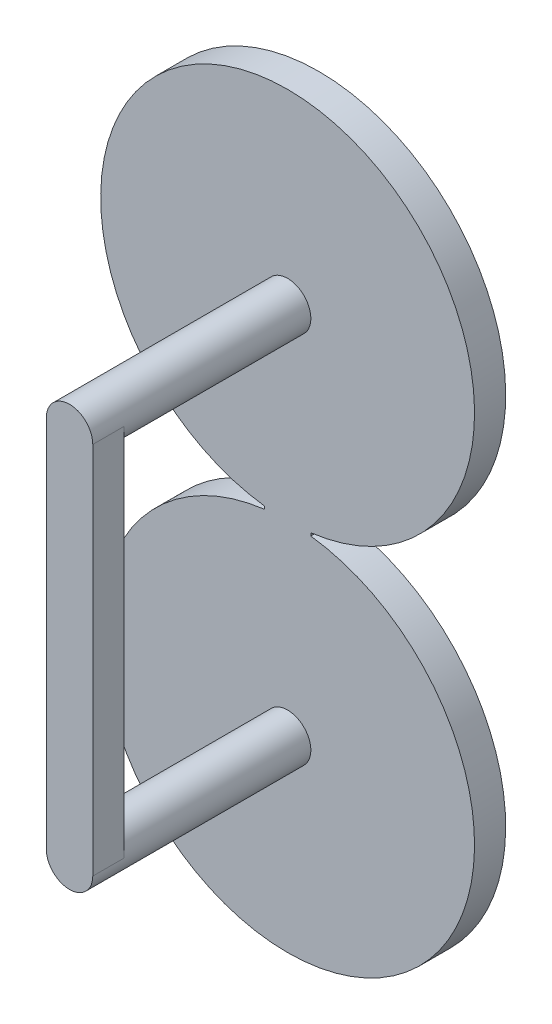
ISO-10303-21;
HEADER;
FILE_DESCRIPTION(('STEP AP214'),'2;1');
FILE_NAME('part.step','',(''),(''),'','','');
FILE_SCHEMA(('AUTOMOTIVE_DESIGN { 1 0 10303 214 1 1 1 1 }'));
ENDSEC;
DATA;
#1=APPLICATION_CONTEXT('core data for automotive mechanical design processes');
#2=APPLICATION_PROTOCOL_DEFINITION('international standard','automotive_design',2000,#1);
#3=PRODUCT_CONTEXT('',#1,'mechanical');
#4=PRODUCT('Part','Part','',(#3));
#5=PRODUCT_RELATED_PRODUCT_CATEGORY('part','',(#4));
#6=PRODUCT_DEFINITION_FORMATION('','',#4);
#7=PRODUCT_DEFINITION_CONTEXT('part definition',#1,'design');
#8=PRODUCT_DEFINITION('design','',#6,#7);
#9=PRODUCT_DEFINITION_SHAPE('','',#8);
#10=(LENGTH_UNIT() NAMED_UNIT(*) SI_UNIT(.MILLI.,.METRE.));
#11=(NAMED_UNIT(*) PLANE_ANGLE_UNIT() SI_UNIT($,.RADIAN.));
#12=(NAMED_UNIT(*) SI_UNIT($,.STERADIAN.) SOLID_ANGLE_UNIT());
#13=UNCERTAINTY_MEASURE_WITH_UNIT(LENGTH_MEASURE(1.E-05),#10,'distance_accuracy_value','');
#14=(GEOMETRIC_REPRESENTATION_CONTEXT(3) GLOBAL_UNCERTAINTY_ASSIGNED_CONTEXT((#13)) GLOBAL_UNIT_ASSIGNED_CONTEXT((#10,
#11,#12)) REPRESENTATION_CONTEXT('',''));
#15=CARTESIAN_POINT('',(0.,0.,0.));
#16=DIRECTION('',(0.,0.,1.));
#17=DIRECTION('',(1.,0.,0.));
#18=AXIS2_PLACEMENT_3D('',#15,#16,#17);
#19=CARTESIAN_POINT('',(0.,0.,4.));
#20=DIRECTION('',(0.,0.,-1.));
#21=DIRECTION('',(-1.,0.,0.));
#22=AXIS2_PLACEMENT_3D('',#19,#20,#21);
#23=CYLINDRICAL_SURFACE('',#22,1.49);
#24=CARTESIAN_POINT('',(0.,0.,-4.));
#25=DIRECTION('',(0.,0.,-1.));
#26=DIRECTION('',(-1.,0.,0.));
#27=AXIS2_PLACEMENT_3D('',#24,#25,#26);
#28=CIRCLE('',#27,1.49);
#29=CARTESIAN_POINT('',(-1.49,0.,-4.));
#30=VERTEX_POINT('',#29);
#31=EDGE_CURVE('E11',#30,#30,#28,.T.);
#32=ORIENTED_EDGE('',*,*,#31,.F.);
#33=EDGE_LOOP('',(#32));
#34=FACE_BOUND('',#33,.T.);
#35=CARTESIAN_POINT('',(0.,0.,8.));
#36=DIRECTION('',(0.,0.,1.));
#37=DIRECTION('',(1.,0.,0.));
#38=AXIS2_PLACEMENT_3D('',#35,#36,#37);
#39=CIRCLE('',#38,1.49);
#40=CARTESIAN_POINT('',(1.49,0.,8.));
#41=VERTEX_POINT('',#40);
#42=CARTESIAN_POINT('',(-1.49,0.,8.));
#43=VERTEX_POINT('',#42);
#44=EDGE_CURVE('E48',#41,#43,#39,.T.);
#45=ORIENTED_EDGE('',*,*,#44,.F.);
#46=DIRECTION('',(0.,0.,-1.));
#47=VECTOR('',#46,1.);
#48=CARTESIAN_POINT('',(1.49,0.,8.));
#49=LINE('',#48,#47);
#50=CARTESIAN_POINT('',(1.49,0.,10.));
#51=VERTEX_POINT('',#50);
#52=EDGE_CURVE('E155',#51,#41,#49,.T.);
#53=ORIENTED_EDGE('',*,*,#52,.F.);
#54=CARTESIAN_POINT('',(0.,0.,10.));
#55=DIRECTION('',(0.,0.,1.));
#56=DIRECTION('',(1.,0.,0.));
#57=AXIS2_PLACEMENT_3D('',#54,#55,#56);
#58=CIRCLE('',#57,1.49);
#59=CARTESIAN_POINT('',(-1.49,0.,10.));
#60=VERTEX_POINT('',#59);
#61=EDGE_CURVE('E153',#51,#60,#58,.F.);
#62=ORIENTED_EDGE('',*,*,#61,.T.);
#63=DIRECTION('',(0.,0.,1.));
#64=VECTOR('',#63,1.);
#65=CARTESIAN_POINT('',(-1.49,0.,8.));
#66=LINE('',#65,#64);
#67=EDGE_CURVE('E112',#43,#60,#66,.T.);
#68=ORIENTED_EDGE('',*,*,#67,.F.);
#69=EDGE_LOOP('',(#45,#53,#62,#68));
#70=FACE_BOUND('',#69,.T.);
#71=ADVANCED_FACE('F41',(#34,#70),#23,.T.);
#72=CARTESIAN_POINT('',(-1.49,-1.491,-4.));
#73=DIRECTION('',(0.,0.,1.));
#74=DIRECTION('',(1.,0.,0.));
#75=AXIS2_PLACEMENT_3D('',#72,#73,#74);
#76=PLANE('',#75);
#77=DIRECTION('',(0.,-1.,0.));
#78=VECTOR('',#77,1.);
#79=CARTESIAN_POINT('',(-1.49,12.,-4.));
#80=LINE('',#79,#78);
#81=CARTESIAN_POINT('',(-1.49,12.0928634844477,-4.));
#82=VERTEX_POINT('',#81);
#83=CARTESIAN_POINT('',(-1.49,11.9071365155523,-4.));
#84=VERTEX_POINT('',#83);
#85=EDGE_CURVE('E176',#82,#84,#80,.T.);
#86=ORIENTED_EDGE('',*,*,#85,.T.);
#87=CARTESIAN_POINT('',(0.,0.,-4.));
#88=DIRECTION('',(0.,0.,1.));
#89=DIRECTION('',(1.,0.,0.));
#90=AXIS2_PLACEMENT_3D('',#87,#88,#89);
#91=CIRCLE('',#90,12.);
#92=CARTESIAN_POINT('',(1.48999999999999,11.9071365155523,-4.));
#93=VERTEX_POINT('',#92);
#94=EDGE_CURVE('E160',#93,#84,#91,.F.);
#95=ORIENTED_EDGE('',*,*,#94,.F.);
#96=DIRECTION('',(0.,-1.,0.));
#97=VECTOR('',#96,1.);
#98=CARTESIAN_POINT('',(1.49,12.,-4.));
#99=LINE('',#98,#97);
#100=CARTESIAN_POINT('',(1.48999999999999,12.0928634844477,-4.));
#101=VERTEX_POINT('',#100);
#102=EDGE_CURVE('E173',#101,#93,#99,.T.);
#103=ORIENTED_EDGE('',*,*,#102,.F.);
#104=CARTESIAN_POINT('',(0.,24.,-4.));
#105=DIRECTION('',(0.,0.,-1.));
#106=DIRECTION('',(1.,0.,0.));
#107=AXIS2_PLACEMENT_3D('',#104,#105,#106);
#108=CIRCLE('',#107,12.);
#109=EDGE_CURVE('E135',#101,#82,#108,.F.);
#110=ORIENTED_EDGE('',*,*,#109,.T.);
#111=EDGE_LOOP('',(#86,#95,#103,#110));
#112=FACE_BOUND('',#111,.T.);
#113=ORIENTED_EDGE('',*,*,#31,.T.);
#114=EDGE_LOOP('',(#113));
#115=FACE_BOUND('',#114,.T.);
#116=CARTESIAN_POINT('',(0.,24.,-4.));
#117=DIRECTION('',(0.,0.,1.));
#118=DIRECTION('',(-1.,0.,0.));
#119=AXIS2_PLACEMENT_3D('',#116,#117,#118);
#120=CIRCLE('',#119,1.49);
#121=CARTESIAN_POINT('',(-1.49,24.,-4.));
#122=VERTEX_POINT('',#121);
#123=EDGE_CURVE('E145',#122,#122,#120,.T.);
#124=ORIENTED_EDGE('',*,*,#123,.F.);
#125=EDGE_LOOP('',(#124));
#126=FACE_BOUND('',#125,.T.);
#127=ADVANCED_FACE('F180',(#112,#115,#126),#76,.T.);
#128=CARTESIAN_POINT('',(-1.49,-1.491,-6.));
#129=DIRECTION('',(0.,0.,-1.));
#130=DIRECTION('',(-1.,0.,0.));
#131=AXIS2_PLACEMENT_3D('',#128,#129,#130);
#132=PLANE('',#131);
#133=DIRECTION('',(0.,-1.,0.));
#134=VECTOR('',#133,1.);
#135=CARTESIAN_POINT('',(1.49,12.,-6.));
#136=LINE('',#135,#134);
#137=CARTESIAN_POINT('',(1.49,12.0928634844477,-6.));
#138=VERTEX_POINT('',#137);
#139=CARTESIAN_POINT('',(1.49,11.9071365155523,-6.));
#140=VERTEX_POINT('',#139);
#141=EDGE_CURVE('E170',#138,#140,#136,.T.);
#142=ORIENTED_EDGE('',*,*,#141,.T.);
#143=CARTESIAN_POINT('',(0.,0.,-6.));
#144=DIRECTION('',(0.,0.,-1.));
#145=DIRECTION('',(-1.,0.,0.));
#146=AXIS2_PLACEMENT_3D('',#143,#144,#145);
#147=CIRCLE('',#146,12.);
#148=CARTESIAN_POINT('',(-1.49,11.9071365155523,-6.));
#149=VERTEX_POINT('',#148);
#150=EDGE_CURVE('E62',#140,#149,#147,.T.);
#151=ORIENTED_EDGE('',*,*,#150,.T.);
#152=DIRECTION('',(0.,-1.,0.));
#153=VECTOR('',#152,1.);
#154=CARTESIAN_POINT('',(-1.49,12.,-6.));
#155=LINE('',#154,#153);
#156=CARTESIAN_POINT('',(-1.49,12.0928634844477,-6.));
#157=VERTEX_POINT('',#156);
#158=EDGE_CURVE('E167',#157,#149,#155,.T.);
#159=ORIENTED_EDGE('',*,*,#158,.F.);
#160=CARTESIAN_POINT('',(0.,24.,-6.));
#161=DIRECTION('',(0.,0.,1.));
#162=DIRECTION('',(-1.,0.,0.));
#163=AXIS2_PLACEMENT_3D('',#160,#161,#162);
#164=CIRCLE('',#163,12.);
#165=EDGE_CURVE('E132',#138,#157,#164,.T.);
#166=ORIENTED_EDGE('',*,*,#165,.F.);
#167=EDGE_LOOP('',(#142,#151,#159,#166));
#168=FACE_BOUND('',#167,.T.);
#169=ADVANCED_FACE('F191',(#168),#132,.T.);
#170=CARTESIAN_POINT('',(-1.49,12.,-4.));
#171=DIRECTION('',(1.,0.,0.));
#172=DIRECTION('',(0.,0.,-1.));
#173=AXIS2_PLACEMENT_3D('',#170,#171,#172);
#174=PLANE('',#173);
#175=ORIENTED_EDGE('',*,*,#158,.T.);
#176=DIRECTION('',(0.,0.,-1.));
#177=VECTOR('',#176,1.);
#178=CARTESIAN_POINT('',(-1.49,11.9071365155523,29.9411254969543));
#179=LINE('',#178,#177);
#180=EDGE_CURVE('E164',#149,#84,#179,.F.);
#181=ORIENTED_EDGE('',*,*,#180,.T.);
#182=ORIENTED_EDGE('',*,*,#85,.F.);
#183=DIRECTION('',(0.,0.,-1.));
#184=VECTOR('',#183,1.);
#185=CARTESIAN_POINT('',(-1.49,12.0928634844477,29.9411254969543));
#186=LINE('',#185,#184);
#187=EDGE_CURVE('E141',#157,#82,#186,.F.);
#188=ORIENTED_EDGE('',*,*,#187,.F.);
#189=EDGE_LOOP('',(#175,#181,#182,#188));
#190=FACE_BOUND('',#189,.T.);
#191=ADVANCED_FACE('F185',(#190),#174,.F.);
#192=CARTESIAN_POINT('',(1.49,12.,-4.));
#193=DIRECTION('',(-1.,0.,0.));
#194=DIRECTION('',(0.,0.,1.));
#195=AXIS2_PLACEMENT_3D('',#192,#193,#194);
#196=PLANE('',#195);
#197=ORIENTED_EDGE('',*,*,#102,.T.);
#198=DIRECTION('',(0.,0.,-1.));
#199=VECTOR('',#198,1.);
#200=CARTESIAN_POINT('',(1.48999999999999,11.9071365155523,29.9411254969543));
#201=LINE('',#200,#199);
#202=EDGE_CURVE('E162',#93,#140,#201,.T.);
#203=ORIENTED_EDGE('',*,*,#202,.T.);
#204=ORIENTED_EDGE('',*,*,#141,.F.);
#205=DIRECTION('',(0.,0.,-1.));
#206=VECTOR('',#205,1.);
#207=CARTESIAN_POINT('',(1.48999999999999,12.0928634844477,29.9411254969543));
#208=LINE('',#207,#206);
#209=EDGE_CURVE('E138',#101,#138,#208,.T.);
#210=ORIENTED_EDGE('',*,*,#209,.F.);
#211=EDGE_LOOP('',(#197,#203,#204,#210));
#212=FACE_BOUND('',#211,.T.);
#213=ADVANCED_FACE('F193',(#212),#196,.F.);
#214=CARTESIAN_POINT('',(0.,0.,29.9411254969543));
#215=DIRECTION('',(0.,0.,-1.));
#216=DIRECTION('',(-1.,0.,0.));
#217=AXIS2_PLACEMENT_3D('',#214,#215,#216);
#218=CYLINDRICAL_SURFACE('',#217,12.);
#219=ORIENTED_EDGE('',*,*,#180,.F.);
#220=ORIENTED_EDGE('',*,*,#150,.F.);
#221=ORIENTED_EDGE('',*,*,#202,.F.);
#222=ORIENTED_EDGE('',*,*,#94,.T.);
#223=EDGE_LOOP('',(#219,#220,#221,#222));
#224=FACE_BOUND('',#223,.T.);
#225=ADVANCED_FACE('F194',(#224),#218,.T.);
#226=CARTESIAN_POINT('',(-1.49,-12.001,10.));
#227=DIRECTION('',(0.,0.,1.));
#228=DIRECTION('',(1.,0.,0.));
#229=AXIS2_PLACEMENT_3D('',#226,#227,#228);
#230=PLANE('',#229);
#231=ORIENTED_EDGE('',*,*,#61,.F.);
#232=DIRECTION('',(0.,-1.,0.));
#233=VECTOR('',#232,1.);
#234=CARTESIAN_POINT('',(1.49,12.,10.));
#235=LINE('',#234,#233);
#236=CARTESIAN_POINT('',(1.49,24.,10.));
#237=VERTEX_POINT('',#236);
#238=EDGE_CURVE('E115',#237,#51,#235,.T.);
#239=ORIENTED_EDGE('',*,*,#238,.F.);
#240=CARTESIAN_POINT('',(0.,24.,10.));
#241=DIRECTION('',(0.,0.,-1.));
#242=DIRECTION('',(1.,0.,0.));
#243=AXIS2_PLACEMENT_3D('',#240,#241,#242);
#244=CIRCLE('',#243,1.49);
#245=CARTESIAN_POINT('',(-1.49,24.,10.));
#246=VERTEX_POINT('',#245);
#247=EDGE_CURVE('E118',#237,#246,#244,.F.);
#248=ORIENTED_EDGE('',*,*,#247,.T.);
#249=DIRECTION('',(0.,-1.,0.));
#250=VECTOR('',#249,1.);
#251=CARTESIAN_POINT('',(-1.49,12.,10.));
#252=LINE('',#251,#250);
#253=EDGE_CURVE('E105',#246,#60,#252,.T.);
#254=ORIENTED_EDGE('',*,*,#253,.T.);
#255=EDGE_LOOP('',(#231,#239,#248,#254));
#256=FACE_BOUND('',#255,.T.);
#257=ADVANCED_FACE('F119',(#256),#230,.T.);
#258=CARTESIAN_POINT('',(-1.49,-12.001,8.));
#259=DIRECTION('',(0.,0.,-1.));
#260=DIRECTION('',(-1.,0.,0.));
#261=AXIS2_PLACEMENT_3D('',#258,#259,#260);
#262=PLANE('',#261);
#263=DIRECTION('',(0.,-1.,0.));
#264=VECTOR('',#263,1.);
#265=CARTESIAN_POINT('',(1.49,12.,8.));
#266=LINE('',#265,#264);
#267=CARTESIAN_POINT('',(1.49,24.,8.));
#268=VERTEX_POINT('',#267);
#269=EDGE_CURVE('E150',#268,#41,#266,.T.);
#270=ORIENTED_EDGE('',*,*,#269,.T.);
#271=ORIENTED_EDGE('',*,*,#44,.T.);
#272=DIRECTION('',(0.,-1.,0.));
#273=VECTOR('',#272,1.);
#274=CARTESIAN_POINT('',(-1.49,12.,8.));
#275=LINE('',#274,#273);
#276=CARTESIAN_POINT('',(-1.49,24.,8.));
#277=VERTEX_POINT('',#276);
#278=EDGE_CURVE('E148',#277,#43,#275,.T.);
#279=ORIENTED_EDGE('',*,*,#278,.F.);
#280=CARTESIAN_POINT('',(0.,24.,8.));
#281=DIRECTION('',(0.,0.,-1.));
#282=DIRECTION('',(1.,0.,0.));
#283=AXIS2_PLACEMENT_3D('',#280,#281,#282);
#284=CIRCLE('',#283,1.49);
#285=EDGE_CURVE('E128',#268,#277,#284,.T.);
#286=ORIENTED_EDGE('',*,*,#285,.F.);
#287=EDGE_LOOP('',(#270,#271,#279,#286));
#288=FACE_BOUND('',#287,.T.);
#289=ADVANCED_FACE('F201',(#288),#262,.T.);
#290=CARTESIAN_POINT('',(-1.49,12.,8.));
#291=DIRECTION('',(1.,0.,0.));
#292=DIRECTION('',(0.,0.,-1.));
#293=AXIS2_PLACEMENT_3D('',#290,#291,#292);
#294=PLANE('',#293);
#295=ORIENTED_EDGE('',*,*,#67,.T.);
#296=ORIENTED_EDGE('',*,*,#253,.F.);
#297=DIRECTION('',(0.,0.,1.));
#298=VECTOR('',#297,1.);
#299=CARTESIAN_POINT('',(-1.49,24.,8.));
#300=LINE('',#299,#298);
#301=EDGE_CURVE('E110',#277,#246,#300,.T.);
#302=ORIENTED_EDGE('',*,*,#301,.F.);
#303=ORIENTED_EDGE('',*,*,#278,.T.);
#304=EDGE_LOOP('',(#295,#296,#302,#303));
#305=FACE_BOUND('',#304,.T.);
#306=ADVANCED_FACE('F107',(#305),#294,.F.);
#307=CARTESIAN_POINT('',(1.49,12.,8.));
#308=DIRECTION('',(-1.,0.,0.));
#309=DIRECTION('',(0.,0.,1.));
#310=AXIS2_PLACEMENT_3D('',#307,#308,#309);
#311=PLANE('',#310);
#312=ORIENTED_EDGE('',*,*,#52,.T.);
#313=ORIENTED_EDGE('',*,*,#269,.F.);
#314=DIRECTION('',(0.,0.,-1.));
#315=VECTOR('',#314,1.);
#316=CARTESIAN_POINT('',(1.49,24.,8.));
#317=LINE('',#316,#315);
#318=EDGE_CURVE('E124',#237,#268,#317,.T.);
#319=ORIENTED_EDGE('',*,*,#318,.F.);
#320=ORIENTED_EDGE('',*,*,#238,.T.);
#321=EDGE_LOOP('',(#312,#313,#319,#320));
#322=FACE_BOUND('',#321,.T.);
#323=ADVANCED_FACE('F214',(#322),#311,.F.);
#324=CARTESIAN_POINT('',(0.,24.,4.));
#325=DIRECTION('',(0.,0.,-1.));
#326=DIRECTION('',(-1.,0.,0.));
#327=AXIS2_PLACEMENT_3D('',#324,#325,#326);
#328=CYLINDRICAL_SURFACE('',#327,1.49);
#329=ORIENTED_EDGE('',*,*,#123,.T.);
#330=EDGE_LOOP('',(#329));
#331=FACE_BOUND('',#330,.T.);
#332=ORIENTED_EDGE('',*,*,#285,.T.);
#333=ORIENTED_EDGE('',*,*,#301,.T.);
#334=ORIENTED_EDGE('',*,*,#247,.F.);
#335=ORIENTED_EDGE('',*,*,#318,.T.);
#336=EDGE_LOOP('',(#332,#333,#334,#335));
#337=FACE_BOUND('',#336,.T.);
#338=ADVANCED_FACE('F126',(#331,#337),#328,.T.);
#339=CARTESIAN_POINT('',(0.,24.,29.9411254969543));
#340=DIRECTION('',(0.,0.,-1.));
#341=DIRECTION('',(-1.,0.,0.));
#342=AXIS2_PLACEMENT_3D('',#339,#340,#341);
#343=CYLINDRICAL_SURFACE('',#342,12.);
#344=ORIENTED_EDGE('',*,*,#187,.T.);
#345=ORIENTED_EDGE('',*,*,#109,.F.);
#346=ORIENTED_EDGE('',*,*,#209,.T.);
#347=ORIENTED_EDGE('',*,*,#165,.T.);
#348=EDGE_LOOP('',(#344,#345,#346,#347));
#349=FACE_BOUND('',#348,.T.);
#350=ADVANCED_FACE('F187',(#349),#343,.T.);
#351=CLOSED_SHELL('',(#71,#127,#169,#191,#213,#225,#257,#289,#306,#323,#338,#350));
#352=MANIFOLD_SOLID_BREP('B2',#351);
#353=ADVANCED_BREP_SHAPE_REPRESENTATION('',(#18,#352),#14);
#354=SHAPE_DEFINITION_REPRESENTATION(#9,#353);
ENDSEC;
END-ISO-10303-21;
